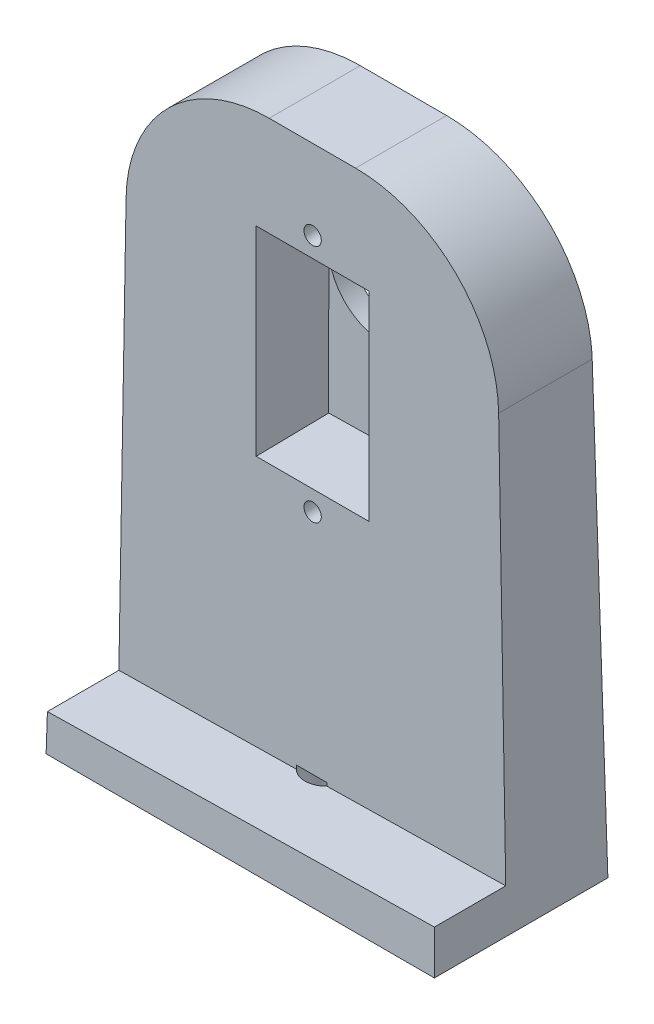
ISO-10303-21;
HEADER;
FILE_DESCRIPTION(('STEP AP214'),'2;1');
FILE_NAME('part.step','',(''),(''),'','','');
FILE_SCHEMA(('AUTOMOTIVE_DESIGN { 1 0 10303 214 1 1 1 1 }'));
ENDSEC;
DATA;
#1=APPLICATION_CONTEXT('core data for automotive mechanical design processes');
#2=APPLICATION_PROTOCOL_DEFINITION('international standard','automotive_design',2000,#1);
#3=PRODUCT_CONTEXT('',#1,'mechanical');
#4=PRODUCT('Part','Part','',(#3));
#5=PRODUCT_RELATED_PRODUCT_CATEGORY('part','',(#4));
#6=PRODUCT_DEFINITION_FORMATION('','',#4);
#7=PRODUCT_DEFINITION_CONTEXT('part definition',#1,'design');
#8=PRODUCT_DEFINITION('design','',#6,#7);
#9=PRODUCT_DEFINITION_SHAPE('','',#8);
#10=(LENGTH_UNIT() NAMED_UNIT(*) SI_UNIT(.MILLI.,.METRE.));
#11=(NAMED_UNIT(*) PLANE_ANGLE_UNIT() SI_UNIT($,.RADIAN.));
#12=(NAMED_UNIT(*) SI_UNIT($,.STERADIAN.) SOLID_ANGLE_UNIT());
#13=UNCERTAINTY_MEASURE_WITH_UNIT(LENGTH_MEASURE(1.E-05),#10,'distance_accuracy_value','');
#14=(GEOMETRIC_REPRESENTATION_CONTEXT(3) GLOBAL_UNCERTAINTY_ASSIGNED_CONTEXT((#13)) GLOBAL_UNIT_ASSIGNED_CONTEXT((#10,
#11,#12)) REPRESENTATION_CONTEXT('',''));
#15=CARTESIAN_POINT('',(0.,0.,0.));
#16=DIRECTION('',(0.,0.,1.));
#17=DIRECTION('',(1.,0.,0.));
#18=AXIS2_PLACEMENT_3D('',#15,#16,#17);
#19=CARTESIAN_POINT('',(-0.120800893597189,-0.0021085874411248,-6.92173277257185));
#20=DIRECTION('',(-0.0174497483512505,-0.000304586490452011,-0.999847695156391));
#21=DIRECTION('',(-0.999847741535795,0.,0.0174497491606827));
#22=AXIS2_PLACEMENT_3D('',#19,#20,#21);
#23=PLANE('',#22);
#24=CARTESIAN_POINT('',(-0.120933777693347,49.9979028174254,-6.93696210127471));
#25=DIRECTION('',(0.0174497483512505,0.000304586490452008,0.999847695156391));
#26=DIRECTION('',(0.999847741535795,0.,-0.0174497491606827));
#27=AXIS2_PLACEMENT_3D('',#24,#25,#26);
#28=CIRCLE('',#27,6.5);
#29=CARTESIAN_POINT('',(-0.120951052621109,56.4979025158905,-6.93894191346264));
#30=VERTEX_POINT('',#29);
#31=CARTESIAN_POINT('',(-6.61994409774487,49.9979200923532,-6.82353873699158));
#32=VERTEX_POINT('',#31);
#33=EDGE_CURVE('E212',#30,#32,#28,.T.);
#34=ORIENTED_EDGE('',*,*,#33,.F.);
#35=DIRECTION('',(-0.999847741546389,2.65768119317444E-06,0.0174497483512505));
#36=VECTOR('',#35,1.);
#37=CARTESIAN_POINT('',(-6.6199564906315,56.4979197908052,-6.82551863438288));
#38=LINE('',#37,#36);
#39=CARTESIAN_POINT('',(-6.6199564906315,56.4979197908052,-6.82551863438288));
#40=VERTEX_POINT('',#39);
#41=EDGE_CURVE('E273',#30,#40,#38,.T.);
#42=ORIENTED_EDGE('',*,*,#41,.T.);
#43=DIRECTION('',(2.65768119366469E-06,-0.999999953610002,0.000304586490452027));
#44=VECTOR('',#43,1.);
#45=CARTESIAN_POINT('',(-6.61989536396405,33.4979208577752,-6.81851314510248));
#46=LINE('',#45,#44);
#47=EDGE_CURVE('E278',#40,#32,#46,.T.);
#48=ORIENTED_EDGE('',*,*,#47,.T.);
#49=EDGE_LOOP('',(#34,#42,#48));
#50=FACE_BOUND('',#49,.T.);
#51=ADVANCED_FACE('F35',(#50),#23,.F.);
#52=CARTESIAN_POINT('',(6.37808142439932,49.9978855424847,-7.0503855507612));
#53=VERTEX_POINT('',#52);
#54=EDGE_CURVE('E269',#32,#53,#28,.T.);
#55=ORIENTED_EDGE('',*,*,#54,.F.);
#56=CARTESIAN_POINT('',(-6.61989536396405,33.4979208577752,-6.81851314510248));
#57=VERTEX_POINT('',#56);
#58=EDGE_CURVE('E277',#32,#57,#46,.T.);
#59=ORIENTED_EDGE('',*,*,#58,.T.);
#60=DIRECTION('',(0.999847741549921,-5.31576697988962E-06,-0.0174497475415718));
#61=VECTOR('',#60,1.);
#62=CARTESIAN_POINT('',(-6.61989536396405,33.4979208577752,-6.81851314510248));
#63=LINE('',#62,#61);
#64=CARTESIAN_POINT('',(6.37812527623085,33.4978517528044,-7.04535986314372));
#65=VERTEX_POINT('',#64);
#66=EDGE_CURVE('E281',#57,#65,#63,.T.);
#67=ORIENTED_EDGE('',*,*,#66,.T.);
#68=DIRECTION('',(-2.65768119365498E-06,0.999999953610002,-0.00030458649045201));
#69=VECTOR('',#68,1.);
#70=CARTESIAN_POINT('',(6.37812527623085,33.4978517528044,-7.04535986314372));
#71=LINE('',#70,#69);
#72=EDGE_CURVE('E270',#65,#53,#71,.T.);
#73=ORIENTED_EDGE('',*,*,#72,.T.);
#74=EDGE_LOOP('',(#55,#59,#67,#73));
#75=FACE_BOUND('',#74,.T.);
#76=ADVANCED_FACE('F342',(#75),#23,.F.);
#77=CARTESIAN_POINT('',(22.38,0.,10.));
#78=DIRECTION('',(0.999847695156391,0.0174524064372835,0.));
#79=DIRECTION('',(-0.0174524064372835,0.999847695156391,0.));
#80=AXIS2_PLACEMENT_3D('',#77,#78,#79);
#81=PLANE('',#80);
#82=DIRECTION('',(0.0174497491606827,-0.999695459881888,-0.0174497491606827));
#83=VECTOR('',#82,1.);
#84=CARTESIAN_POINT('',(22.3663708599393,0.78081291113767,-9.9863708599393));
#85=LINE('',#84,#83);
#86=CARTESIAN_POINT('',(21.4760377135528,51.7879647062152,-9.09603771355277));
#87=VERTEX_POINT('',#86);
#88=CARTESIAN_POINT('',(22.38,0.,-10.));
#89=VERTEX_POINT('',#88);
#90=EDGE_CURVE('E187',#87,#89,#85,.T.);
#91=ORIENTED_EDGE('',*,*,#90,.F.);
#92=DIRECTION('',(0.,0.,-1.));
#93=VECTOR('',#92,1.);
#94=CARTESIAN_POINT('',(21.4760377135528,51.7879647062152,10.));
#95=LINE('',#94,#93);
#96=CARTESIAN_POINT('',(21.4760377135528,51.7879647062152,1.6869444151188));
#97=VERTEX_POINT('',#96);
#98=EDGE_CURVE('E43',#87,#97,#95,.F.);
#99=ORIENTED_EDGE('',*,*,#98,.T.);
#100=DIRECTION('',(0.0174524064372835,-0.999847695156391,0.));
#101=VECTOR('',#100,1.);
#102=CARTESIAN_POINT('',(22.3731833543437,0.390525368100986,1.68694441511879));
#103=LINE('',#102,#101);
#104=CARTESIAN_POINT('',(22.2927379678136,4.99923847578196,1.68694441511879));
#105=VERTEX_POINT('',#104);
#106=EDGE_CURVE('E156',#97,#105,#103,.T.);
#107=ORIENTED_EDGE('',*,*,#106,.T.);
#108=DIRECTION('',(0.,0.,-1.));
#109=VECTOR('',#108,1.);
#110=CARTESIAN_POINT('',(22.2927379678136,4.99923847578196,0.));
#111=LINE('',#110,#109);
#112=CARTESIAN_POINT('',(22.2927379678136,4.99923847578196,9.91273796781358));
#113=VERTEX_POINT('',#112);
#114=EDGE_CURVE('E146',#113,#105,#111,.T.);
#115=ORIENTED_EDGE('',*,*,#114,.F.);
#116=DIRECTION('',(0.0174497491606827,-0.999695459881888,0.0174497491606827));
#117=VECTOR('',#116,1.);
#118=CARTESIAN_POINT('',(22.38,0.,10.));
#119=LINE('',#118,#117);
#120=CARTESIAN_POINT('',(22.38,0.,10.));
#121=VERTEX_POINT('',#120);
#122=EDGE_CURVE('E191',#113,#121,#119,.T.);
#123=ORIENTED_EDGE('',*,*,#122,.T.);
#124=DIRECTION('',(0.,0.,-1.));
#125=VECTOR('',#124,1.);
#126=CARTESIAN_POINT('',(22.38,0.,10.));
#127=LINE('',#126,#125);
#128=EDGE_CURVE('E155',#121,#89,#127,.T.);
#129=ORIENTED_EDGE('',*,*,#128,.T.);
#130=EDGE_LOOP('',(#91,#99,#107,#115,#123,#129));
#131=FACE_BOUND('',#130,.T.);
#132=ADVANCED_FACE('F166',(#131),#81,.T.);
#133=CARTESIAN_POINT('',(-22.38,0.,10.));
#134=DIRECTION('',(-0.999847695156391,0.0174524064372835,0.));
#135=DIRECTION('',(-0.0174524064372835,-0.999847695156391,0.));
#136=AXIS2_PLACEMENT_3D('',#133,#134,#135);
#137=PLANE('',#136);
#138=DIRECTION('',(0.,0.,1.));
#139=VECTOR('',#138,1.);
#140=CARTESIAN_POINT('',(-22.306326379147,4.220758911868,10.));
#141=LINE('',#140,#139);
#142=CARTESIAN_POINT('',(-22.306326379147,4.220758911868,9.92632637914699));
#143=VERTEX_POINT('',#142);
#144=CARTESIAN_POINT('',(-22.306326379147,4.220758911868,1.68694441511879));
#145=VERTEX_POINT('',#144);
#146=EDGE_CURVE('E246',#143,#145,#141,.F.);
#147=ORIENTED_EDGE('',*,*,#146,.T.);
#148=DIRECTION('',(-0.0174524064372835,-0.999847695156391,0.));
#149=VECTOR('',#148,1.);
#150=CARTESIAN_POINT('',(-22.38,0.,1.68694441511879));
#151=LINE('',#150,#149);
#152=CARTESIAN_POINT('',(-21.4760377135528,51.7879647062152,1.68694441511879));
#153=VERTEX_POINT('',#152);
#154=EDGE_CURVE('E238',#145,#153,#151,.F.);
#155=ORIENTED_EDGE('',*,*,#154,.T.);
#156=DIRECTION('',(0.,0.,1.));
#157=VECTOR('',#156,1.);
#158=CARTESIAN_POINT('',(-21.4760377135528,51.7879647062152,10.));
#159=LINE('',#158,#157);
#160=CARTESIAN_POINT('',(-21.4760377135528,51.7879647062152,-9.09603771355277));
#161=VERTEX_POINT('',#160);
#162=EDGE_CURVE('E202',#153,#161,#159,.F.);
#163=ORIENTED_EDGE('',*,*,#162,.T.);
#164=DIRECTION('',(-0.0174497491606827,-0.999695459881888,-0.0174497491606827));
#165=VECTOR('',#164,1.);
#166=CARTESIAN_POINT('',(-22.3739101250846,0.348888700240246,-9.99391012508459));
#167=LINE('',#166,#165);
#168=CARTESIAN_POINT('',(-22.38,0.,-10.));
#169=VERTEX_POINT('',#168);
#170=EDGE_CURVE('E190',#161,#169,#167,.T.);
#171=ORIENTED_EDGE('',*,*,#170,.T.);
#172=DIRECTION('',(0.,0.,1.));
#173=VECTOR('',#172,1.);
#174=CARTESIAN_POINT('',(-22.38,0.,10.));
#175=LINE('',#174,#173);
#176=CARTESIAN_POINT('',(-22.38,0.,10.));
#177=VERTEX_POINT('',#176);
#178=EDGE_CURVE('E180',#169,#177,#175,.T.);
#179=ORIENTED_EDGE('',*,*,#178,.T.);
#180=DIRECTION('',(-0.0174497491606827,-0.999695459881888,0.0174497491606827));
#181=VECTOR('',#180,1.);
#182=CARTESIAN_POINT('',(-22.38,0.,10.));
#183=LINE('',#182,#181);
#184=EDGE_CURVE('E193',#143,#177,#183,.T.);
#185=ORIENTED_EDGE('',*,*,#184,.F.);
#186=EDGE_LOOP('',(#147,#155,#163,#171,#179,#185));
#187=FACE_BOUND('',#186,.T.);
#188=ADVANCED_FACE('F313',(#187),#137,.T.);
#189=CARTESIAN_POINT('',(0.,68.,0.));
#190=DIRECTION('',(0.,-1.,0.));
#191=DIRECTION('',(0.,0.,-1.));
#192=AXIS2_PLACEMENT_3D('',#189,#190,#191);
#193=PLANE('',#192);
#194=DIRECTION('',(0.,0.,-1.));
#195=VECTOR('',#194,1.);
#196=CARTESIAN_POINT('',(-4.97855074347232,68.,0.));
#197=LINE('',#196,#195);
#198=CARTESIAN_POINT('',(-4.97855074347232,68.,-8.8130555848812));
#199=VERTEX_POINT('',#198);
#200=CARTESIAN_POINT('',(-4.97855074347232,68.,1.68694441511879));
#201=VERTEX_POINT('',#200);
#202=EDGE_CURVE('E199',#199,#201,#197,.F.);
#203=ORIENTED_EDGE('',*,*,#202,.T.);
#204=DIRECTION('',(1.,0.,0.));
#205=VECTOR('',#204,1.);
#206=CARTESIAN_POINT('',(0.,68.,1.68694441511879));
#207=LINE('',#206,#205);
#208=CARTESIAN_POINT('',(4.97855074347231,68.,1.68694441511879));
#209=VERTEX_POINT('',#208);
#210=EDGE_CURVE('E233',#201,#209,#207,.T.);
#211=ORIENTED_EDGE('',*,*,#210,.T.);
#212=DIRECTION('',(0.,0.,1.));
#213=VECTOR('',#212,1.);
#214=CARTESIAN_POINT('',(4.97855074347231,68.,0.));
#215=LINE('',#214,#213);
#216=CARTESIAN_POINT('',(4.97855074347231,68.,-8.8130555848812));
#217=VERTEX_POINT('',#216);
#218=EDGE_CURVE('E189',#209,#217,#215,.F.);
#219=ORIENTED_EDGE('',*,*,#218,.T.);
#220=DIRECTION('',(1.,0.,0.));
#221=VECTOR('',#220,1.);
#222=CARTESIAN_POINT('',(0.,68.,-8.8130555848812));
#223=LINE('',#222,#221);
#224=EDGE_CURVE('E186',#217,#199,#223,.F.);
#225=ORIENTED_EDGE('',*,*,#224,.T.);
#226=EDGE_LOOP('',(#203,#211,#219,#225));
#227=FACE_BOUND('',#226,.T.);
#228=ADVANCED_FACE('F325',(#227),#193,.F.);
#229=CARTESIAN_POINT('',(-22.38,0.,-10.));
#230=DIRECTION('',(0.,0.0174524064372835,-0.999847695156391));
#231=DIRECTION('',(0.,0.999847695156391,0.0174524064372836));
#232=AXIS2_PLACEMENT_3D('',#229,#230,#231);
#233=PLANE('',#232);
#234=CARTESIAN_POINT('',(-0.159160357795179,49.9972355699878,-9.12729500689447));
#235=DIRECTION('',(0.,0.0174524064372835,-0.999847695156391));
#236=DIRECTION('',(0.7009635739523,0.71308845177365,0.0124470052252712));
#237=AXIS2_PLACEMENT_3D('',#234,#235,#236);
#238=ELLIPSE('',#237,6.50201498912459,6.5);
#239=CARTESIAN_POINT('',(4.39851530687302,54.6337473719917,-9.04636439235005));
#240=VERTEX_POINT('',#239);
#241=EDGE_CURVE('E209',#240,#240,#238,.F.);
#242=ORIENTED_EDGE('',*,*,#241,.T.);
#243=EDGE_LOOP('',(#242));
#244=FACE_BOUND('',#243,.T.);
#245=ORIENTED_EDGE('',*,*,#170,.F.);
#246=CARTESIAN_POINT('',(-4.97855074347232,51.5,-9.10106415619679));
#247=DIRECTION('',(0.,0.0174524064372835,-0.999847695156391));
#248=DIRECTION('',(0.,-0.999847695156391,-0.0174524064372836));
#249=AXIS2_PLACEMENT_3D('',#246,#247,#248);
#250=ELLIPSE('',#249,16.5025134127245,16.5);
#251=EDGE_CURVE('E206',#161,#199,#250,.T.);
#252=ORIENTED_EDGE('',*,*,#251,.T.);
#253=ORIENTED_EDGE('',*,*,#224,.F.);
#254=CARTESIAN_POINT('',(4.97855074347231,51.5,-9.10106415619679));
#255=DIRECTION('',(0.,0.0174524064372835,-0.999847695156391));
#256=DIRECTION('',(0.,0.999847695156391,0.0174524064372836));
#257=AXIS2_PLACEMENT_3D('',#254,#255,#256);
#258=ELLIPSE('',#257,16.5025134127245,16.5);
#259=EDGE_CURVE('E204',#217,#87,#258,.T.);
#260=ORIENTED_EDGE('',*,*,#259,.T.);
#261=ORIENTED_EDGE('',*,*,#90,.T.);
#262=DIRECTION('',(-1.,0.,0.));
#263=VECTOR('',#262,1.);
#264=CARTESIAN_POINT('',(-22.38,0.,-10.));
#265=LINE('',#264,#263);
#266=EDGE_CURVE('E177',#89,#169,#265,.T.);
#267=ORIENTED_EDGE('',*,*,#266,.T.);
#268=EDGE_LOOP('',(#245,#252,#253,#260,#261,#267));
#269=FACE_BOUND('',#268,.T.);
#270=ADVANCED_FACE('F318',(#244,#269),#233,.T.);
#271=CARTESIAN_POINT('',(-22.38,0.,10.));
#272=DIRECTION('',(0.,0.0174524064372835,0.999847695156391));
#273=DIRECTION('',(0.,-0.999847695156391,0.0174524064372836));
#274=AXIS2_PLACEMENT_3D('',#271,#272,#273);
#275=PLANE('',#274);
#276=ORIENTED_EDGE('',*,*,#122,.F.);
#277=DIRECTION('',(0.999847648762863,0.0174524056274815,-0.00030463287338128));
#278=VECTOR('',#277,1.);
#279=CARTESIAN_POINT('',(-22.4536511671915,4.21818734812715,9.92637126595906));
#280=LINE('',#279,#278);
#281=EDGE_CURVE('E151',#113,#143,#280,.F.);
#282=ORIENTED_EDGE('',*,*,#281,.T.);
#283=ORIENTED_EDGE('',*,*,#184,.T.);
#284=DIRECTION('',(1.,0.,0.));
#285=VECTOR('',#284,1.);
#286=CARTESIAN_POINT('',(-22.38,0.,10.));
#287=LINE('',#286,#285);
#288=EDGE_CURVE('E183',#177,#121,#287,.T.);
#289=ORIENTED_EDGE('',*,*,#288,.T.);
#290=EDGE_LOOP('',(#276,#282,#283,#289));
#291=FACE_BOUND('',#290,.T.);
#292=ADVANCED_FACE('F303',(#291),#275,.T.);
#293=CARTESIAN_POINT('',(0.,0.,0.));
#294=DIRECTION('',(0.,-1.,0.));
#295=DIRECTION('',(0.,0.,-1.));
#296=AXIS2_PLACEMENT_3D('',#293,#294,#295);
#297=PLANE('',#296);
#298=CARTESIAN_POINT('',(-4.58641587904904,0.,0.));
#299=DIRECTION('',(0.,1.,0.));
#300=DIRECTION('',(0.,0.,1.));
#301=AXIS2_PLACEMENT_3D('',#298,#299,#300);
#302=CIRCLE('',#301,1.3);
#303=CARTESIAN_POINT('',(-4.58641587904904,0.,1.3));
#304=VERTEX_POINT('',#303);
#305=EDGE_CURVE('E250',#304,#304,#302,.T.);
#306=ORIENTED_EDGE('',*,*,#305,.T.);
#307=EDGE_LOOP('',(#306));
#308=FACE_BOUND('',#307,.T.);
#309=CARTESIAN_POINT('',(4.41358412095096,0.,0.));
#310=DIRECTION('',(0.,1.,0.));
#311=DIRECTION('',(0.,0.,1.));
#312=AXIS2_PLACEMENT_3D('',#309,#310,#311);
#313=CIRCLE('',#312,1.3);
#314=CARTESIAN_POINT('',(4.41358412095096,0.,1.3));
#315=VERTEX_POINT('',#314);
#316=EDGE_CURVE('E257',#315,#315,#313,.T.);
#317=ORIENTED_EDGE('',*,*,#316,.T.);
#318=EDGE_LOOP('',(#317));
#319=FACE_BOUND('',#318,.T.);
#320=CARTESIAN_POINT('',(-0.0872620321864213,0.,-0.0872620321864179));
#321=DIRECTION('',(0.,-1.,0.));
#322=DIRECTION('',(0.,0.,-1.));
#323=AXIS2_PLACEMENT_3D('',#320,#321,#322);
#324=CIRCLE('',#323,2.5);
#325=CARTESIAN_POINT('',(-0.0872620321864213,0.,-2.58726203218642));
#326=VERTEX_POINT('',#325);
#327=EDGE_CURVE('E171',#326,#326,#324,.T.);
#328=ORIENTED_EDGE('',*,*,#327,.F.);
#329=EDGE_LOOP('',(#328));
#330=FACE_BOUND('',#329,.T.);
#331=ORIENTED_EDGE('',*,*,#128,.F.);
#332=ORIENTED_EDGE('',*,*,#288,.F.);
#333=ORIENTED_EDGE('',*,*,#178,.F.);
#334=ORIENTED_EDGE('',*,*,#266,.F.);
#335=EDGE_LOOP('',(#331,#332,#333,#334));
#336=FACE_BOUND('',#335,.T.);
#337=ADVANCED_FACE('F300',(#308,#319,#330,#336),#297,.T.);
#338=CARTESIAN_POINT('',(-0.0872620321864213,12.0703062876474,-0.0872620321864179));
#339=DIRECTION('',(0.,-1.,0.));
#340=DIRECTION('',(0.,0.,-1.));
#341=AXIS2_PLACEMENT_3D('',#338,#339,#340);
#342=CYLINDRICAL_SURFACE('',#341,2.5);
#343=CARTESIAN_POINT('',(-0.0872620321864213,4.60859412268845,-0.0872620321864179));
#344=DIRECTION('',(0.0174524064372835,-0.999847695156391,0.));
#345=DIRECTION('',(-0.999847695156391,-0.0174524064372836,0.));
#346=AXIS2_PLACEMENT_3D('',#343,#344,#345);
#347=ELLIPSE('',#346,2.50038082010977,2.5);
#348=CARTESIAN_POINT('',(-1.84856594756862,4.57785044848713,1.68694441511879));
#349=VERTEX_POINT('',#348);
#350=CARTESIAN_POINT('',(1.67404188319575,4.63933779688977,1.68694441511879));
#351=VERTEX_POINT('',#350);
#352=EDGE_CURVE('E11',#349,#351,#347,.F.);
#353=ORIENTED_EDGE('',*,*,#352,.T.);
#354=DIRECTION('',(0.,-1.,0.));
#355=VECTOR('',#354,1.);
#356=CARTESIAN_POINT('',(1.67404188319577,12.0703062876474,1.68694441511879));
#357=LINE('',#356,#355);
#358=CARTESIAN_POINT('',(1.67404188319577,4.99923847578196,1.68694441511879));
#359=VERTEX_POINT('',#358);
#360=EDGE_CURVE('E161',#351,#359,#357,.F.);
#361=ORIENTED_EDGE('',*,*,#360,.T.);
#362=CARTESIAN_POINT('',(-0.0872620321864213,4.99923847578196,-0.0872620321864179));
#363=DIRECTION('',(0.,-1.,0.));
#364=DIRECTION('',(0.,0.,-1.));
#365=AXIS2_PLACEMENT_3D('',#362,#363,#364);
#366=CIRCLE('',#365,2.5);
#367=CARTESIAN_POINT('',(-1.84856594756861,4.99923847578196,1.68694441511879));
#368=VERTEX_POINT('',#367);
#369=EDGE_CURVE('E168',#359,#368,#366,.F.);
#370=ORIENTED_EDGE('',*,*,#369,.T.);
#371=DIRECTION('',(0.,-1.,0.));
#372=VECTOR('',#371,1.);
#373=CARTESIAN_POINT('',(-1.84856594756861,12.0703062876474,1.68694441511879));
#374=LINE('',#373,#372);
#375=EDGE_CURVE('E50',#368,#349,#374,.T.);
#376=ORIENTED_EDGE('',*,*,#375,.T.);
#377=EDGE_LOOP('',(#353,#361,#370,#376));
#378=FACE_BOUND('',#377,.T.);
#379=ORIENTED_EDGE('',*,*,#327,.T.);
#380=EDGE_LOOP('',(#379));
#381=FACE_BOUND('',#380,.T.);
#382=ADVANCED_FACE('F298',(#378,#381),#342,.F.);
#383=CARTESIAN_POINT('',(22.2927379678136,4.99923847578196,0.));
#384=DIRECTION('',(0.,-1.,0.));
#385=DIRECTION('',(0.,0.,-1.));
#386=AXIS2_PLACEMENT_3D('',#383,#384,#385);
#387=PLANE('',#386);
#388=DIRECTION('',(1.,0.,0.));
#389=VECTOR('',#388,1.);
#390=CARTESIAN_POINT('',(22.2927379678136,4.99923847578196,1.68694441511879));
#391=LINE('',#390,#389);
#392=EDGE_CURVE('E241',#368,#359,#391,.T.);
#393=ORIENTED_EDGE('',*,*,#392,.F.);
#394=ORIENTED_EDGE('',*,*,#369,.F.);
#395=EDGE_LOOP('',(#393,#394));
#396=FACE_BOUND('',#395,.T.);
#397=ADVANCED_FACE('F332',(#396),#387,.T.);
#398=CARTESIAN_POINT('',(-4.97855074347232,51.5,0.));
#399=DIRECTION('',(0.,0.,-1.));
#400=DIRECTION('',(-1.,0.,0.));
#401=AXIS2_PLACEMENT_3D('',#398,#399,#400);
#402=CYLINDRICAL_SURFACE('',#401,16.5);
#403=CARTESIAN_POINT('',(-4.97855074347232,51.5,1.68694441511879));
#404=DIRECTION('',(0.,0.,-1.));
#405=DIRECTION('',(-1.,0.,0.));
#406=AXIS2_PLACEMENT_3D('',#403,#404,#405);
#407=CIRCLE('',#406,16.5);
#408=EDGE_CURVE('E236',#201,#153,#407,.F.);
#409=ORIENTED_EDGE('',*,*,#408,.F.);
#410=ORIENTED_EDGE('',*,*,#202,.F.);
#411=ORIENTED_EDGE('',*,*,#251,.F.);
#412=ORIENTED_EDGE('',*,*,#162,.F.);
#413=EDGE_LOOP('',(#409,#410,#411,#412));
#414=FACE_BOUND('',#413,.T.);
#415=ADVANCED_FACE('F328',(#414),#402,.T.);
#416=CARTESIAN_POINT('',(4.97855074347231,51.5,0.));
#417=DIRECTION('',(0.,0.,1.));
#418=DIRECTION('',(1.,0.,0.));
#419=AXIS2_PLACEMENT_3D('',#416,#417,#418);
#420=CYLINDRICAL_SURFACE('',#419,16.5);
#421=CARTESIAN_POINT('',(4.97855074347231,51.5,1.68694441511879));
#422=DIRECTION('',(0.,0.,-1.));
#423=DIRECTION('',(-1.,0.,0.));
#424=AXIS2_PLACEMENT_3D('',#421,#422,#423);
#425=CIRCLE('',#424,16.5);
#426=EDGE_CURVE('E231',#97,#209,#425,.F.);
#427=ORIENTED_EDGE('',*,*,#426,.F.);
#428=ORIENTED_EDGE('',*,*,#98,.F.);
#429=ORIENTED_EDGE('',*,*,#259,.F.);
#430=ORIENTED_EDGE('',*,*,#218,.F.);
#431=EDGE_LOOP('',(#427,#428,#429,#430));
#432=FACE_BOUND('',#431,.T.);
#433=ADVANCED_FACE('F37',(#432),#420,.T.);
#434=CARTESIAN_POINT('',(6.37812527623085,33.4978517528044,-7.04535986314372));
#435=DIRECTION('',(0.999847741546389,-2.65768119364173E-06,-0.0174497483512505));
#436=DIRECTION('',(-0.0174497483513122,0.,-0.99984774154992));
#437=AXIS2_PLACEMENT_3D('',#434,#435,#436);
#438=PLANE('',#437);
#439=DIRECTION('',(0.0174497483512505,0.000304586490452012,0.999847695156391));
#440=VECTOR('',#439,1.);
#441=CARTESIAN_POINT('',(6.37812527623085,33.4978517528044,-7.04535986314372));
#442=LINE('',#441,#440);
#443=CARTESIAN_POINT('',(6.53052499962912,33.5005118998714,1.68694441511879));
#444=VERTEX_POINT('',#443);
#445=EDGE_CURVE('E285',#65,#444,#442,.T.);
#446=ORIENTED_EDGE('',*,*,#445,.T.);
#447=DIRECTION('',(2.65808590968252E-06,0.999999999996467,0.));
#448=VECTOR('',#447,1.);
#449=CARTESIAN_POINT('',(6.53052499255714,33.4978513477129,1.68694441511879));
#450=LINE('',#449,#448);
#451=CARTESIAN_POINT('',(6.53058613569973,56.5005475221223,1.68694441511879));
#452=VERTEX_POINT('',#451);
#453=EDGE_CURVE('E228',#444,#452,#450,.T.);
#454=ORIENTED_EDGE('',*,*,#453,.T.);
#455=DIRECTION('',(0.0174497483512505,0.000304586490452012,0.999847695156391));
#456=VECTOR('',#455,1.);
#457=CARTESIAN_POINT('',(6.37806414947156,56.4978852409497,-7.05236536294913));
#458=LINE('',#457,#456);
#459=CARTESIAN_POINT('',(6.37806414947156,56.4978852409497,-7.05236536294913));
#460=VERTEX_POINT('',#459);
#461=EDGE_CURVE('E284',#460,#452,#458,.T.);
#462=ORIENTED_EDGE('',*,*,#461,.F.);
#463=EDGE_CURVE('E211',#53,#460,#71,.T.);
#464=ORIENTED_EDGE('',*,*,#463,.F.);
#465=ORIENTED_EDGE('',*,*,#72,.F.);
#466=EDGE_LOOP('',(#446,#454,#462,#464,#465));
#467=FACE_BOUND('',#466,.T.);
#468=ADVANCED_FACE('F372',(#467),#438,.F.);
#469=CARTESIAN_POINT('',(-6.61989536396405,33.4979208577752,-6.81851314510248));
#470=DIRECTION('',(0.,-0.999999953599405,0.000304632873381154));
#471=DIRECTION('',(0.,-0.000304632873381154,-0.999999953599405));
#472=AXIS2_PLACEMENT_3D('',#469,#470,#471);
#473=PLANE('',#472);
#474=DIRECTION('',(0.0174497483512505,0.000304586490452012,0.999847695156391));
#475=VECTOR('',#474,1.);
#476=CARTESIAN_POINT('',(-6.61989536396405,33.4979208577752,-6.81851314510248));
#477=LINE('',#476,#475);
#478=CARTESIAN_POINT('',(-6.471454661688,33.5005118998714,1.68694441511879));
#479=VERTEX_POINT('',#478);
#480=EDGE_CURVE('E288',#57,#479,#477,.T.);
#481=ORIENTED_EDGE('',*,*,#480,.T.);
#482=DIRECTION('',(1.,0.,0.));
#483=VECTOR('',#482,1.);
#484=CARTESIAN_POINT('',(-6.61989536396405,33.5005118998714,1.68694441511879));
#485=LINE('',#484,#483);
#486=EDGE_CURVE('E225',#479,#444,#485,.T.);
#487=ORIENTED_EDGE('',*,*,#486,.T.);
#488=ORIENTED_EDGE('',*,*,#445,.F.);
#489=ORIENTED_EDGE('',*,*,#66,.F.);
#490=EDGE_LOOP('',(#481,#487,#488,#489));
#491=FACE_BOUND('',#490,.T.);
#492=ADVANCED_FACE('F378',(#491),#473,.F.);
#493=CARTESIAN_POINT('',(-6.61989536396405,33.4979208577752,-6.81851314510248));
#494=DIRECTION('',(-0.999847741546389,2.65768119363231E-06,0.0174497483512505));
#495=DIRECTION('',(0.0174497483513122,0.,0.99984774154992));
#496=AXIS2_PLACEMENT_3D('',#493,#494,#495);
#497=PLANE('',#496);
#498=DIRECTION('',(0.0174497483512505,0.000304586490452012,0.999847695156391));
#499=VECTOR('',#498,1.);
#500=CARTESIAN_POINT('',(-6.6199564906315,56.4979197908052,-6.82551863438288));
#501=LINE('',#500,#499);
#502=CARTESIAN_POINT('',(-6.47139352570924,56.5005129670039,1.68694441511879));
#503=VERTEX_POINT('',#502);
#504=EDGE_CURVE('E291',#40,#503,#501,.T.);
#505=ORIENTED_EDGE('',*,*,#504,.T.);
#506=DIRECTION('',(-2.65808590967309E-06,-0.999999999996467,0.));
#507=VECTOR('',#506,1.);
#508=CARTESIAN_POINT('',(-6.47145466857626,33.497920463207,1.68694441511879));
#509=LINE('',#508,#507);
#510=EDGE_CURVE('E58',#503,#479,#509,.T.);
#511=ORIENTED_EDGE('',*,*,#510,.T.);
#512=ORIENTED_EDGE('',*,*,#480,.F.);
#513=ORIENTED_EDGE('',*,*,#58,.F.);
#514=ORIENTED_EDGE('',*,*,#47,.F.);
#515=EDGE_LOOP('',(#505,#511,#512,#513,#514));
#516=FACE_BOUND('',#515,.T.);
#517=ADVANCED_FACE('F363',(#516),#497,.F.);
#518=CARTESIAN_POINT('',(-6.6199564906315,56.4979197908052,-6.82551863438288));
#519=DIRECTION('',(-2.65768119412223E-06,0.999999953610002,-0.000304586490452004));
#520=DIRECTION('',(0.,0.00030458649045308,0.999999953613534));
#521=AXIS2_PLACEMENT_3D('',#518,#519,#520);
#522=PLANE('',#521);
#523=ORIENTED_EDGE('',*,*,#461,.T.);
#524=DIRECTION('',(-0.999999999996468,-2.65768131740267E-06,0.));
#525=VECTOR('',#524,1.);
#526=CARTESIAN_POINT('',(-6.61995649752229,56.5005125721708,1.68694441511879));
#527=LINE('',#526,#525);
#528=EDGE_CURVE('E219',#452,#503,#527,.T.);
#529=ORIENTED_EDGE('',*,*,#528,.T.);
#530=ORIENTED_EDGE('',*,*,#504,.F.);
#531=ORIENTED_EDGE('',*,*,#41,.F.);
#532=EDGE_CURVE('E274',#460,#30,#38,.T.);
#533=ORIENTED_EDGE('',*,*,#532,.F.);
#534=EDGE_LOOP('',(#523,#529,#530,#531,#533));
#535=FACE_BOUND('',#534,.T.);
#536=ADVANCED_FACE('F355',(#535),#522,.F.);
#537=EDGE_CURVE('E265',#53,#30,#28,.T.);
#538=ORIENTED_EDGE('',*,*,#537,.F.);
#539=ORIENTED_EDGE('',*,*,#463,.T.);
#540=ORIENTED_EDGE('',*,*,#532,.T.);
#541=EDGE_LOOP('',(#538,#539,#540));
#542=FACE_BOUND('',#541,.T.);
#543=ADVANCED_FACE('F345',(#542),#23,.F.);
#544=CARTESIAN_POINT('',(-0.181418360194868,49.9968470551107,-10.4026493529942));
#545=DIRECTION('',(0.0174497483512505,0.000304586490452008,0.999847695156391));
#546=DIRECTION('',(0.999847741535795,0.,-0.0174497491606827));
#547=AXIS2_PLACEMENT_3D('',#544,#545,#546);
#548=CYLINDRICAL_SURFACE('',#547,6.5);
#549=ORIENTED_EDGE('',*,*,#33,.T.);
#550=ORIENTED_EDGE('',*,*,#54,.T.);
#551=ORIENTED_EDGE('',*,*,#537,.T.);
#552=EDGE_LOOP('',(#549,#550,#551));
#553=FACE_BOUND('',#552,.T.);
#554=ORIENTED_EDGE('',*,*,#241,.F.);
#555=EDGE_LOOP('',(#554));
#556=FACE_BOUND('',#555,.T.);
#557=ADVANCED_FACE('F354',(#553,#556),#548,.F.);
#558=CARTESIAN_POINT('',(4.41358412095096,0.,0.));
#559=DIRECTION('',(0.,1.,0.));
#560=DIRECTION('',(0.,0.,1.));
#561=AXIS2_PLACEMENT_3D('',#558,#559,#560);
#562=CYLINDRICAL_SURFACE('',#561,1.3);
#563=ORIENTED_EDGE('',*,*,#316,.F.);
#564=EDGE_LOOP('',(#563));
#565=FACE_BOUND('',#564,.T.);
#566=CARTESIAN_POINT('',(4.41358412095096,4.99923847578196,0.));
#567=DIRECTION('',(0.,1.,0.));
#568=DIRECTION('',(0.,0.,1.));
#569=AXIS2_PLACEMENT_3D('',#566,#567,#568);
#570=CIRCLE('',#569,1.3);
#571=CARTESIAN_POINT('',(4.41358412095096,4.99923847578196,1.3));
#572=VERTEX_POINT('',#571);
#573=EDGE_CURVE('E249',#572,#572,#570,.T.);
#574=ORIENTED_EDGE('',*,*,#573,.T.);
#575=EDGE_LOOP('',(#574));
#576=FACE_BOUND('',#575,.T.);
#577=ADVANCED_FACE('F361',(#565,#576),#562,.F.);
#578=CARTESIAN_POINT('',(4.41358412095096,4.99923847578196,0.));
#579=DIRECTION('',(0.,1.,0.));
#580=DIRECTION('',(0.,0.,1.));
#581=AXIS2_PLACEMENT_3D('',#578,#579,#580);
#582=PLANE('',#581);
#583=ORIENTED_EDGE('',*,*,#573,.F.);
#584=EDGE_LOOP('',(#583));
#585=FACE_BOUND('',#584,.T.);
#586=ADVANCED_FACE('F542',(#585),#582,.F.);
#587=CARTESIAN_POINT('',(-4.58641587904904,0.,0.));
#588=DIRECTION('',(0.,1.,0.));
#589=DIRECTION('',(0.,0.,1.));
#590=AXIS2_PLACEMENT_3D('',#587,#588,#589);
#591=CYLINDRICAL_SURFACE('',#590,1.3);
#592=ORIENTED_EDGE('',*,*,#305,.F.);
#593=EDGE_LOOP('',(#592));
#594=FACE_BOUND('',#593,.T.);
#595=CARTESIAN_POINT('',(-4.58641587904904,4.99923847578196,0.));
#596=DIRECTION('',(0.,1.,0.));
#597=DIRECTION('',(0.,0.,1.));
#598=AXIS2_PLACEMENT_3D('',#595,#596,#597);
#599=CIRCLE('',#598,1.3);
#600=CARTESIAN_POINT('',(-4.58641587904904,4.99923847578196,1.3));
#601=VERTEX_POINT('',#600);
#602=EDGE_CURVE('E254',#601,#601,#599,.T.);
#603=ORIENTED_EDGE('',*,*,#602,.T.);
#604=EDGE_LOOP('',(#603));
#605=FACE_BOUND('',#604,.T.);
#606=ADVANCED_FACE('F552',(#594,#605),#591,.F.);
#607=CARTESIAN_POINT('',(-4.58641587904904,4.99923847578196,0.));
#608=DIRECTION('',(0.,1.,0.));
#609=DIRECTION('',(0.,0.,1.));
#610=AXIS2_PLACEMENT_3D('',#607,#608,#609);
#611=PLANE('',#610);
#612=ORIENTED_EDGE('',*,*,#602,.F.);
#613=EDGE_LOOP('',(#612));
#614=FACE_BOUND('',#613,.T.);
#615=ADVANCED_FACE('F481',(#614),#611,.F.);
#616=CARTESIAN_POINT('',(-52.6958391689158,3.69030799298569,1.68694441511879));
#617=DIRECTION('',(0.0174524064372835,-0.999847695156391,0.));
#618=DIRECTION('',(0.999847695156391,0.0174524064372836,0.));
#619=AXIS2_PLACEMENT_3D('',#616,#617,#618);
#620=PLANE('',#619);
#621=ORIENTED_EDGE('',*,*,#281,.F.);
#622=ORIENTED_EDGE('',*,*,#114,.T.);
#623=DIRECTION('',(0.999847695156391,0.0174524064372835,0.));
#624=VECTOR('',#623,1.);
#625=CARTESIAN_POINT('',(-52.6958391689158,3.69030799298569,1.68694441511879));
#626=LINE('',#625,#624);
#627=EDGE_CURVE('E149',#351,#105,#626,.T.);
#628=ORIENTED_EDGE('',*,*,#627,.F.);
#629=ORIENTED_EDGE('',*,*,#352,.F.);
#630=EDGE_CURVE('E162',#145,#349,#626,.T.);
#631=ORIENTED_EDGE('',*,*,#630,.F.);
#632=ORIENTED_EDGE('',*,*,#146,.F.);
#633=EDGE_LOOP('',(#621,#622,#628,#629,#631,#632));
#634=FACE_BOUND('',#633,.T.);
#635=ADVANCED_FACE('F148',(#634),#620,.F.);
#636=CARTESIAN_POINT('',(-52.6958391689158,3.69030799298569,1.68694441511879));
#637=DIRECTION('',(0.,0.,-1.));
#638=DIRECTION('',(-1.,0.,0.));
#639=AXIS2_PLACEMENT_3D('',#636,#637,#638);
#640=PLANE('',#639);
#641=CARTESIAN_POINT('',(0.0295975350649812,58.8005303512634,1.68694441511879));
#642=DIRECTION('',(0.,0.,-1.));
#643=DIRECTION('',(0.999847695156391,0.0174524064372765,0.));
#644=AXIS2_PLACEMENT_3D('',#641,#642,#643);
#645=ELLIPSE('',#644,1.00015232804391,1.);
#646=CARTESIAN_POINT('',(1.02959753506498,58.8179854161916,1.68694441511879));
#647=VERTEX_POINT('',#646);
#648=EDGE_CURVE('E213',#647,#647,#645,.F.);
#649=ORIENTED_EDGE('',*,*,#648,.F.);
#650=EDGE_LOOP('',(#649));
#651=FACE_BOUND('',#650,.T.);
#652=CARTESIAN_POINT('',(0.0295241718904697,31.2005290707044,1.68694441511879));
#653=DIRECTION('',(0.,0.,-1.));
#654=DIRECTION('',(0.999847695156391,0.0174524064372765,0.));
#655=AXIS2_PLACEMENT_3D('',#652,#653,#654);
#656=ELLIPSE('',#655,1.00015232804391,1.);
#657=CARTESIAN_POINT('',(1.02952417189047,31.2179841356326,1.68694441511879));
#658=VERTEX_POINT('',#657);
#659=EDGE_CURVE('E215',#658,#658,#656,.F.);
#660=ORIENTED_EDGE('',*,*,#659,.F.);
#661=EDGE_LOOP('',(#660));
#662=FACE_BOUND('',#661,.T.);
#663=ORIENTED_EDGE('',*,*,#486,.F.);
#664=ORIENTED_EDGE('',*,*,#510,.F.);
#665=ORIENTED_EDGE('',*,*,#528,.F.);
#666=ORIENTED_EDGE('',*,*,#453,.F.);
#667=EDGE_LOOP('',(#663,#664,#665,#666));
#668=FACE_BOUND('',#667,.T.);
#669=ORIENTED_EDGE('',*,*,#627,.T.);
#670=ORIENTED_EDGE('',*,*,#106,.F.);
#671=ORIENTED_EDGE('',*,*,#426,.T.);
#672=ORIENTED_EDGE('',*,*,#210,.F.);
#673=ORIENTED_EDGE('',*,*,#408,.T.);
#674=ORIENTED_EDGE('',*,*,#154,.F.);
#675=ORIENTED_EDGE('',*,*,#630,.T.);
#676=ORIENTED_EDGE('',*,*,#375,.F.);
#677=ORIENTED_EDGE('',*,*,#392,.T.);
#678=ORIENTED_EDGE('',*,*,#360,.F.);
#679=EDGE_LOOP('',(#669,#670,#671,#672,#673,#674,#675,#676,#677,#678));
#680=FACE_BOUND('',#679,.T.);
#681=ADVANCED_FACE('F158',(#651,#662,#668,#680),#640,.F.);
#682=CARTESIAN_POINT('',(-0.103434064935656,31.1982082760479,-5.93138818009782));
#683=DIRECTION('',(0.0174497483512505,0.000304586490452012,0.999847695156391));
#684=DIRECTION('',(0.999847741535795,0.,-0.0174497491606827));
#685=AXIS2_PLACEMENT_3D('',#682,#683,#684);
#686=PLANE('',#685);
#687=CARTESIAN_POINT('',(-0.103434064935656,31.1982082760479,-5.93138818009782));
#688=DIRECTION('',(0.0174497483512505,0.000304586490452012,0.999847695156391));
#689=DIRECTION('',(0.999847741535795,0.,-0.0174497491606827));
#690=AXIS2_PLACEMENT_3D('',#687,#688,#689);
#691=CIRCLE('',#690,1.);
#692=CARTESIAN_POINT('',(0.89641367660014,31.1982082760479,-5.9488379292585));
#693=VERTEX_POINT('',#692);
#694=EDGE_CURVE('E253',#693,#693,#691,.T.);
#695=ORIENTED_EDGE('',*,*,#694,.T.);
#696=EDGE_LOOP('',(#695));
#697=FACE_BOUND('',#696,.T.);
#698=ADVANCED_FACE('F492',(#697),#686,.T.);
#699=CARTESIAN_POINT('',(-0.103434064935656,31.1982082760479,-5.93138818009782));
#700=DIRECTION('',(0.0174497483512505,0.000304586490452012,0.999847695156391));
#701=DIRECTION('',(0.999847741535795,0.,-0.0174497491606827));
#702=AXIS2_PLACEMENT_3D('',#699,#700,#701);
#703=CYLINDRICAL_SURFACE('',#702,1.);
#704=ORIENTED_EDGE('',*,*,#659,.T.);
#705=EDGE_LOOP('',(#704));
#706=FACE_BOUND('',#705,.T.);
#707=ORIENTED_EDGE('',*,*,#694,.F.);
#708=EDGE_LOOP('',(#707));
#709=FACE_BOUND('',#708,.T.);
#710=ADVANCED_FACE('F499',(#706,#709),#703,.F.);
#711=CARTESIAN_POINT('',(-0.1035074169366,58.7982069956839,-5.93979476723429));
#712=DIRECTION('',(0.0174497483512505,0.000304586490452012,0.999847695156391));
#713=DIRECTION('',(0.999847741535795,0.,-0.0174497491606827));
#714=AXIS2_PLACEMENT_3D('',#711,#712,#713);
#715=PLANE('',#714);
#716=CARTESIAN_POINT('',(-0.1035074169366,58.7982069956839,-5.93979476723429));
#717=DIRECTION('',(0.0174497483512505,0.000304586490452012,0.999847695156391));
#718=DIRECTION('',(0.999847741535795,0.,-0.0174497491606827));
#719=AXIS2_PLACEMENT_3D('',#716,#717,#718);
#720=CIRCLE('',#719,1.);
#721=CARTESIAN_POINT('',(0.896340324599196,58.7982069956839,-5.95724451639497));
#722=VERTEX_POINT('',#721);
#723=EDGE_CURVE('E262',#722,#722,#720,.T.);
#724=ORIENTED_EDGE('',*,*,#723,.T.);
#725=EDGE_LOOP('',(#724));
#726=FACE_BOUND('',#725,.T.);
#727=ADVANCED_FACE('F504',(#726),#715,.T.);
#728=CARTESIAN_POINT('',(-0.1035074169366,58.7982069956839,-5.93979476723429));
#729=DIRECTION('',(0.0174497483512505,0.000304586490452012,0.999847695156391));
#730=DIRECTION('',(0.999847741535795,0.,-0.0174497491606827));
#731=AXIS2_PLACEMENT_3D('',#728,#729,#730);
#732=CYLINDRICAL_SURFACE('',#731,1.);
#733=ORIENTED_EDGE('',*,*,#648,.T.);
#734=EDGE_LOOP('',(#733));
#735=FACE_BOUND('',#734,.T.);
#736=ORIENTED_EDGE('',*,*,#723,.F.);
#737=EDGE_LOOP('',(#736));
#738=FACE_BOUND('',#737,.T.);
#739=ADVANCED_FACE('F513',(#735,#738),#732,.F.);
#740=CLOSED_SHELL('',(#51,#76,#132,#188,#228,#270,#292,#337,#382,#397,#415,#433,#468,#492,#517,
#536,#543,#557,#577,#586,#606,#615,#635,#681,#698,#710,#727,#739));
#741=MANIFOLD_SOLID_BREP('B2',#740);
#742=ADVANCED_BREP_SHAPE_REPRESENTATION('',(#18,#741),#14);
#743=SHAPE_DEFINITION_REPRESENTATION(#9,#742);
ENDSEC;
END-ISO-10303-21;
